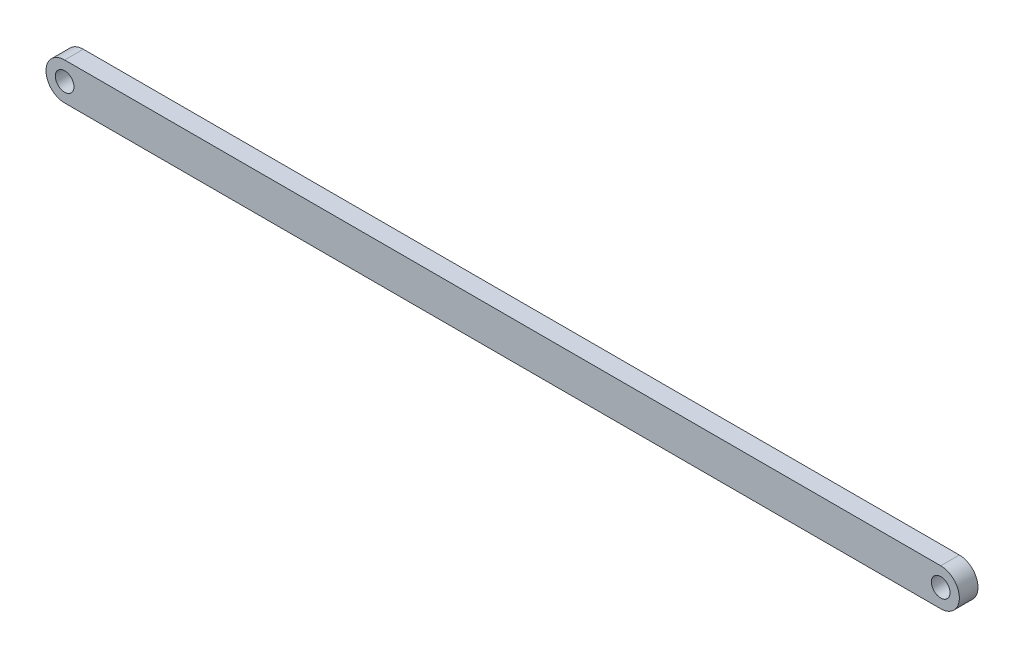
ISO-10303-21;
HEADER;
FILE_DESCRIPTION(('STEP AP214'),'2;1');
FILE_NAME('part.step','',(''),(''),'','','');
FILE_SCHEMA(('AUTOMOTIVE_DESIGN { 1 0 10303 214 1 1 1 1 }'));
ENDSEC;
DATA;
#1=APPLICATION_CONTEXT('core data for automotive mechanical design processes');
#2=APPLICATION_PROTOCOL_DEFINITION('international standard','automotive_design',2000,#1);
#3=PRODUCT_CONTEXT('',#1,'mechanical');
#4=PRODUCT('Part','Part','',(#3));
#5=PRODUCT_RELATED_PRODUCT_CATEGORY('part','',(#4));
#6=PRODUCT_DEFINITION_FORMATION('','',#4);
#7=PRODUCT_DEFINITION_CONTEXT('part definition',#1,'design');
#8=PRODUCT_DEFINITION('design','',#6,#7);
#9=PRODUCT_DEFINITION_SHAPE('','',#8);
#10=(LENGTH_UNIT() NAMED_UNIT(*) SI_UNIT(.MILLI.,.METRE.));
#11=(NAMED_UNIT(*) PLANE_ANGLE_UNIT() SI_UNIT($,.RADIAN.));
#12=(NAMED_UNIT(*) SI_UNIT($,.STERADIAN.) SOLID_ANGLE_UNIT());
#13=UNCERTAINTY_MEASURE_WITH_UNIT(LENGTH_MEASURE(1.E-05),#10,'distance_accuracy_value','');
#14=(GEOMETRIC_REPRESENTATION_CONTEXT(3) GLOBAL_UNCERTAINTY_ASSIGNED_CONTEXT((#13)) GLOBAL_UNIT_ASSIGNED_CONTEXT((#10,
#11,#12)) REPRESENTATION_CONTEXT('',''));
#15=CARTESIAN_POINT('',(0.,0.,0.));
#16=DIRECTION('',(0.,0.,1.));
#17=DIRECTION('',(1.,0.,0.));
#18=AXIS2_PLACEMENT_3D('',#15,#16,#17);
#19=CARTESIAN_POINT('',(0.,0.,50.));
#20=DIRECTION('',(0.,0.,1.));
#21=DIRECTION('',(1.,0.,0.));
#22=AXIS2_PLACEMENT_3D('',#19,#20,#21);
#23=PLANE('',#22);
#24=CARTESIAN_POINT('',(0.,0.,50.));
#25=DIRECTION('',(0.,0.,1.));
#26=DIRECTION('',(1.,0.,0.));
#27=AXIS2_PLACEMENT_3D('',#24,#25,#26);
#28=CIRCLE('',#27,25.);
#29=CARTESIAN_POINT('',(25.,0.,50.));
#30=VERTEX_POINT('',#29);
#31=EDGE_CURVE('E102',#30,#30,#28,.T.);
#32=ORIENTED_EDGE('',*,*,#31,.F.);
#33=EDGE_LOOP('',(#32));
#34=FACE_BOUND('',#33,.T.);
#35=CARTESIAN_POINT('',(0.,0.,50.));
#36=DIRECTION('',(0.,0.,1.));
#37=DIRECTION('',(1.,0.,0.));
#38=AXIS2_PLACEMENT_3D('',#35,#36,#37);
#39=CIRCLE('',#38,50.);
#40=CARTESIAN_POINT('',(0.,50.,50.));
#41=VERTEX_POINT('',#40);
#42=CARTESIAN_POINT('',(0.,-50.,50.));
#43=VERTEX_POINT('',#42);
#44=EDGE_CURVE('E87',#41,#43,#39,.T.);
#45=ORIENTED_EDGE('',*,*,#44,.T.);
#46=DIRECTION('',(1.,0.,0.));
#47=VECTOR('',#46,1.);
#48=CARTESIAN_POINT('',(0.,-50.,50.));
#49=LINE('',#48,#47);
#50=CARTESIAN_POINT('',(2350.,-50.,50.));
#51=VERTEX_POINT('',#50);
#52=EDGE_CURVE('E82',#43,#51,#49,.T.);
#53=ORIENTED_EDGE('',*,*,#52,.T.);
#54=CARTESIAN_POINT('',(2350.,0.,50.));
#55=DIRECTION('',(0.,0.,1.));
#56=DIRECTION('',(1.,0.,0.));
#57=AXIS2_PLACEMENT_3D('',#54,#55,#56);
#58=CIRCLE('',#57,50.);
#59=CARTESIAN_POINT('',(2350.,50.,50.));
#60=VERTEX_POINT('',#59);
#61=EDGE_CURVE('E85',#51,#60,#58,.T.);
#62=ORIENTED_EDGE('',*,*,#61,.T.);
#63=DIRECTION('',(-1.,0.,0.));
#64=VECTOR('',#63,1.);
#65=CARTESIAN_POINT('',(0.,50.,50.));
#66=LINE('',#65,#64);
#67=EDGE_CURVE('E52',#60,#41,#66,.T.);
#68=ORIENTED_EDGE('',*,*,#67,.T.);
#69=EDGE_LOOP('',(#45,#53,#62,#68));
#70=FACE_BOUND('',#69,.T.);
#71=CARTESIAN_POINT('',(2350.,0.,50.));
#72=DIRECTION('',(0.,0.,1.));
#73=DIRECTION('',(1.,0.,0.));
#74=AXIS2_PLACEMENT_3D('',#71,#72,#73);
#75=CIRCLE('',#74,25.);
#76=CARTESIAN_POINT('',(2375.,0.,50.));
#77=VERTEX_POINT('',#76);
#78=EDGE_CURVE('E117',#77,#77,#75,.T.);
#79=ORIENTED_EDGE('',*,*,#78,.F.);
#80=EDGE_LOOP('',(#79));
#81=FACE_BOUND('',#80,.T.);
#82=ADVANCED_FACE('F35',(#34,#70,#81),#23,.T.);
#83=CARTESIAN_POINT('',(0.,0.,0.));
#84=DIRECTION('',(0.,0.,1.));
#85=DIRECTION('',(1.,0.,0.));
#86=AXIS2_PLACEMENT_3D('',#83,#84,#85);
#87=PLANE('',#86);
#88=CARTESIAN_POINT('',(0.,0.,0.));
#89=DIRECTION('',(0.,0.,1.));
#90=DIRECTION('',(1.,0.,0.));
#91=AXIS2_PLACEMENT_3D('',#88,#89,#90);
#92=CIRCLE('',#91,50.);
#93=CARTESIAN_POINT('',(0.,50.,0.));
#94=VERTEX_POINT('',#93);
#95=CARTESIAN_POINT('',(0.,-50.,0.));
#96=VERTEX_POINT('',#95);
#97=EDGE_CURVE('E99',#94,#96,#92,.T.);
#98=ORIENTED_EDGE('',*,*,#97,.F.);
#99=DIRECTION('',(-1.,0.,0.));
#100=VECTOR('',#99,1.);
#101=CARTESIAN_POINT('',(0.,50.,0.));
#102=LINE('',#101,#100);
#103=CARTESIAN_POINT('',(2350.,50.,0.));
#104=VERTEX_POINT('',#103);
#105=EDGE_CURVE('E75',#104,#94,#102,.T.);
#106=ORIENTED_EDGE('',*,*,#105,.F.);
#107=CARTESIAN_POINT('',(2350.,0.,0.));
#108=DIRECTION('',(0.,0.,1.));
#109=DIRECTION('',(1.,0.,0.));
#110=AXIS2_PLACEMENT_3D('',#107,#108,#109);
#111=CIRCLE('',#110,50.);
#112=CARTESIAN_POINT('',(2350.,-50.,0.));
#113=VERTEX_POINT('',#112);
#114=EDGE_CURVE('E69',#113,#104,#111,.T.);
#115=ORIENTED_EDGE('',*,*,#114,.F.);
#116=DIRECTION('',(1.,0.,0.));
#117=VECTOR('',#116,1.);
#118=CARTESIAN_POINT('',(0.,-50.,0.));
#119=LINE('',#118,#117);
#120=EDGE_CURVE('E91',#96,#113,#119,.T.);
#121=ORIENTED_EDGE('',*,*,#120,.F.);
#122=EDGE_LOOP('',(#98,#106,#115,#121));
#123=FACE_BOUND('',#122,.T.);
#124=CARTESIAN_POINT('',(0.,0.,0.));
#125=DIRECTION('',(0.,0.,1.));
#126=DIRECTION('',(1.,0.,0.));
#127=AXIS2_PLACEMENT_3D('',#124,#125,#126);
#128=CIRCLE('',#127,25.);
#129=CARTESIAN_POINT('',(25.,0.,0.));
#130=VERTEX_POINT('',#129);
#131=EDGE_CURVE('E114',#130,#130,#128,.T.);
#132=ORIENTED_EDGE('',*,*,#131,.T.);
#133=EDGE_LOOP('',(#132));
#134=FACE_BOUND('',#133,.T.);
#135=CARTESIAN_POINT('',(2350.,0.,0.));
#136=DIRECTION('',(0.,0.,1.));
#137=DIRECTION('',(1.,0.,0.));
#138=AXIS2_PLACEMENT_3D('',#135,#136,#137);
#139=CIRCLE('',#138,25.);
#140=CARTESIAN_POINT('',(2375.,0.,0.));
#141=VERTEX_POINT('',#140);
#142=EDGE_CURVE('E120',#141,#141,#139,.T.);
#143=ORIENTED_EDGE('',*,*,#142,.T.);
#144=EDGE_LOOP('',(#143));
#145=FACE_BOUND('',#144,.T.);
#146=ADVANCED_FACE('F110',(#123,#134,#145),#87,.F.);
#147=CARTESIAN_POINT('',(0.,0.,50.));
#148=DIRECTION('',(0.,0.,-1.));
#149=DIRECTION('',(-1.,0.,0.));
#150=AXIS2_PLACEMENT_3D('',#147,#148,#149);
#151=CYLINDRICAL_SURFACE('',#150,50.);
#152=ORIENTED_EDGE('',*,*,#97,.T.);
#153=DIRECTION('',(0.,0.,-1.));
#154=VECTOR('',#153,1.);
#155=CARTESIAN_POINT('',(0.,-50.,50.));
#156=LINE('',#155,#154);
#157=EDGE_CURVE('E11',#43,#96,#156,.T.);
#158=ORIENTED_EDGE('',*,*,#157,.F.);
#159=ORIENTED_EDGE('',*,*,#44,.F.);
#160=DIRECTION('',(0.,0.,-1.));
#161=VECTOR('',#160,1.);
#162=CARTESIAN_POINT('',(0.,50.,50.));
#163=LINE('',#162,#161);
#164=EDGE_CURVE('E95',#41,#94,#163,.T.);
#165=ORIENTED_EDGE('',*,*,#164,.T.);
#166=EDGE_LOOP('',(#152,#158,#159,#165));
#167=FACE_BOUND('',#166,.T.);
#168=ADVANCED_FACE('F37',(#167),#151,.T.);
#169=CARTESIAN_POINT('',(0.,-50.,50.));
#170=DIRECTION('',(0.,1.,0.));
#171=DIRECTION('',(0.,0.,1.));
#172=AXIS2_PLACEMENT_3D('',#169,#170,#171);
#173=PLANE('',#172);
#174=ORIENTED_EDGE('',*,*,#120,.T.);
#175=DIRECTION('',(0.,0.,-1.));
#176=VECTOR('',#175,1.);
#177=CARTESIAN_POINT('',(2350.,-50.,50.));
#178=LINE('',#177,#176);
#179=EDGE_CURVE('E44',#51,#113,#178,.T.);
#180=ORIENTED_EDGE('',*,*,#179,.F.);
#181=ORIENTED_EDGE('',*,*,#52,.F.);
#182=ORIENTED_EDGE('',*,*,#157,.T.);
#183=EDGE_LOOP('',(#174,#180,#181,#182));
#184=FACE_BOUND('',#183,.T.);
#185=ADVANCED_FACE('F90',(#184),#173,.F.);
#186=CARTESIAN_POINT('',(2350.,0.,50.));
#187=DIRECTION('',(0.,0.,-1.));
#188=DIRECTION('',(-1.,0.,0.));
#189=AXIS2_PLACEMENT_3D('',#186,#187,#188);
#190=CYLINDRICAL_SURFACE('',#189,50.);
#191=ORIENTED_EDGE('',*,*,#114,.T.);
#192=DIRECTION('',(0.,0.,-1.));
#193=VECTOR('',#192,1.);
#194=CARTESIAN_POINT('',(2350.,50.,50.));
#195=LINE('',#194,#193);
#196=EDGE_CURVE('E92',#60,#104,#195,.T.);
#197=ORIENTED_EDGE('',*,*,#196,.F.);
#198=ORIENTED_EDGE('',*,*,#61,.F.);
#199=ORIENTED_EDGE('',*,*,#179,.T.);
#200=EDGE_LOOP('',(#191,#197,#198,#199));
#201=FACE_BOUND('',#200,.T.);
#202=ADVANCED_FACE('F93',(#201),#190,.T.);
#203=CARTESIAN_POINT('',(0.,50.,50.));
#204=DIRECTION('',(0.,-1.,0.));
#205=DIRECTION('',(0.,0.,-1.));
#206=AXIS2_PLACEMENT_3D('',#203,#204,#205);
#207=PLANE('',#206);
#208=ORIENTED_EDGE('',*,*,#105,.T.);
#209=ORIENTED_EDGE('',*,*,#164,.F.);
#210=ORIENTED_EDGE('',*,*,#67,.F.);
#211=ORIENTED_EDGE('',*,*,#196,.T.);
#212=EDGE_LOOP('',(#208,#209,#210,#211));
#213=FACE_BOUND('',#212,.T.);
#214=ADVANCED_FACE('F107',(#213),#207,.F.);
#215=CARTESIAN_POINT('',(0.,0.,50.));
#216=DIRECTION('',(0.,0.,-1.));
#217=DIRECTION('',(-1.,0.,0.));
#218=AXIS2_PLACEMENT_3D('',#215,#216,#217);
#219=CYLINDRICAL_SURFACE('',#218,25.);
#220=ORIENTED_EDGE('',*,*,#31,.T.);
#221=EDGE_LOOP('',(#220));
#222=FACE_BOUND('',#221,.T.);
#223=ORIENTED_EDGE('',*,*,#131,.F.);
#224=EDGE_LOOP('',(#223));
#225=FACE_BOUND('',#224,.T.);
#226=ADVANCED_FACE('F137',(#222,#225),#219,.F.);
#227=CARTESIAN_POINT('',(2350.,0.,50.));
#228=DIRECTION('',(0.,0.,-1.));
#229=DIRECTION('',(-1.,0.,0.));
#230=AXIS2_PLACEMENT_3D('',#227,#228,#229);
#231=CYLINDRICAL_SURFACE('',#230,25.);
#232=ORIENTED_EDGE('',*,*,#78,.T.);
#233=EDGE_LOOP('',(#232));
#234=FACE_BOUND('',#233,.T.);
#235=ORIENTED_EDGE('',*,*,#142,.F.);
#236=EDGE_LOOP('',(#235));
#237=FACE_BOUND('',#236,.T.);
#238=ADVANCED_FACE('F126',(#234,#237),#231,.F.);
#239=CLOSED_SHELL('',(#82,#146,#168,#185,#202,#214,#226,#238));
#240=MANIFOLD_SOLID_BREP('B2',#239);
#241=ADVANCED_BREP_SHAPE_REPRESENTATION('',(#18,#240),#14);
#242=SHAPE_DEFINITION_REPRESENTATION(#9,#241);
ENDSEC;
END-ISO-10303-21;
